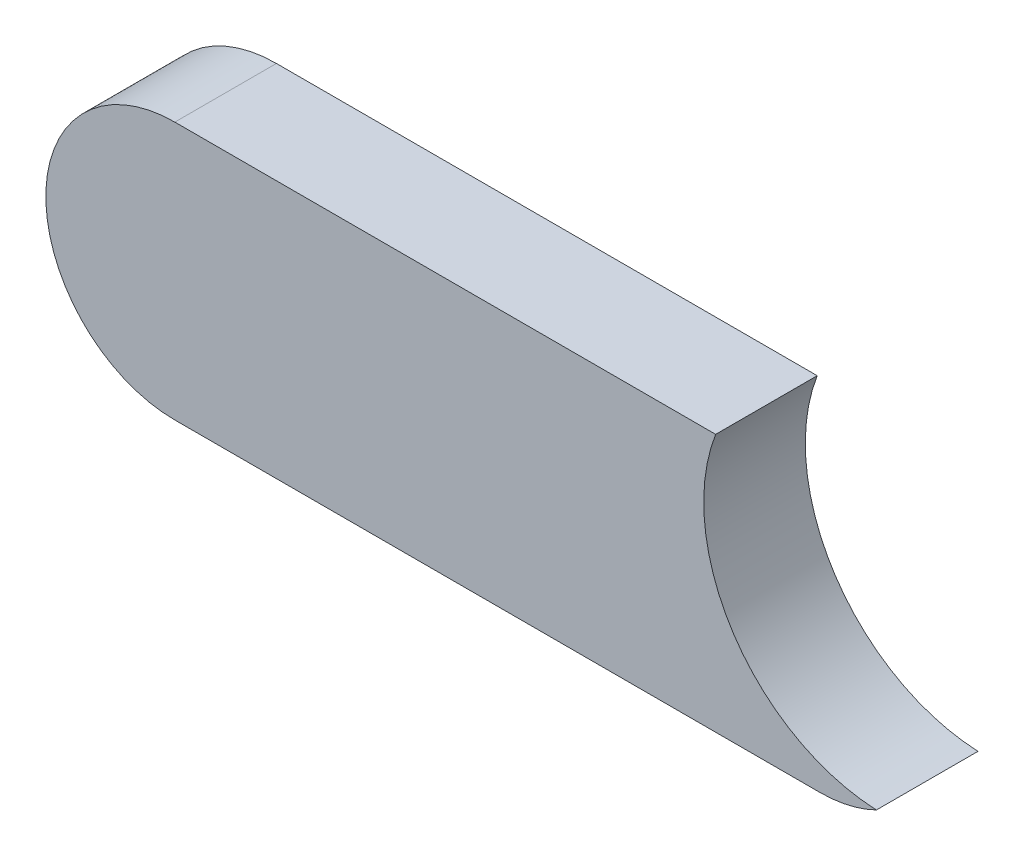
ISO-10303-21;
HEADER;
FILE_DESCRIPTION(('STEP AP214'),'2;1');
FILE_NAME('part.step','',(''),(''),'','','');
FILE_SCHEMA(('AUTOMOTIVE_DESIGN { 1 0 10303 214 1 1 1 1 }'));
ENDSEC;
DATA;
#1=APPLICATION_CONTEXT('core data for automotive mechanical design processes');
#2=APPLICATION_PROTOCOL_DEFINITION('international standard','automotive_design',2000,#1);
#3=PRODUCT_CONTEXT('',#1,'mechanical');
#4=PRODUCT('Part','Part','',(#3));
#5=PRODUCT_RELATED_PRODUCT_CATEGORY('part','',(#4));
#6=PRODUCT_DEFINITION_FORMATION('','',#4);
#7=PRODUCT_DEFINITION_CONTEXT('part definition',#1,'design');
#8=PRODUCT_DEFINITION('design','',#6,#7);
#9=PRODUCT_DEFINITION_SHAPE('','',#8);
#10=(LENGTH_UNIT() NAMED_UNIT(*) SI_UNIT(.MILLI.,.METRE.));
#11=(NAMED_UNIT(*) PLANE_ANGLE_UNIT() SI_UNIT($,.RADIAN.));
#12=(NAMED_UNIT(*) SI_UNIT($,.STERADIAN.) SOLID_ANGLE_UNIT());
#13=UNCERTAINTY_MEASURE_WITH_UNIT(LENGTH_MEASURE(1.E-05),#10,'distance_accuracy_value','');
#14=(GEOMETRIC_REPRESENTATION_CONTEXT(3) GLOBAL_UNCERTAINTY_ASSIGNED_CONTEXT((#13)) GLOBAL_UNIT_ASSIGNED_CONTEXT((#10,
#11,#12)) REPRESENTATION_CONTEXT('',''));
#15=CARTESIAN_POINT('',(0.,0.,0.));
#16=DIRECTION('',(0.,0.,1.));
#17=DIRECTION('',(1.,0.,0.));
#18=AXIS2_PLACEMENT_3D('',#15,#16,#17);
#19=CARTESIAN_POINT('',(135.001,111.252,0.));
#20=DIRECTION('',(0.,1.,0.));
#21=DIRECTION('',(1.,0.,0.));
#22=AXIS2_PLACEMENT_3D('',#19,#20,#21);
#23=PLANE('',#22);
#24=DIRECTION('',(1.,0.,0.));
#25=VECTOR('',#24,1.);
#26=CARTESIAN_POINT('',(135.001,111.252,0.1999996));
#27=LINE('',#26,#25);
#28=CARTESIAN_POINT('',(135.001,111.252,0.1999996));
#29=VERTEX_POINT('',#28);
#30=CARTESIAN_POINT('',(136.271,111.252,0.1999996));
#31=VERTEX_POINT('',#30);
#32=EDGE_CURVE('E11',#29,#31,#27,.T.);
#33=ORIENTED_EDGE('',*,*,#32,.F.);
#34=DIRECTION('',(0.,0.,1.));
#35=VECTOR('',#34,1.);
#36=CARTESIAN_POINT('',(135.001,111.252,0.));
#37=LINE('',#36,#35);
#38=CARTESIAN_POINT('',(135.001,111.252,0.));
#39=VERTEX_POINT('',#38);
#40=EDGE_CURVE('E24',#39,#29,#37,.T.);
#41=ORIENTED_EDGE('',*,*,#40,.F.);
#42=DIRECTION('',(1.,0.,0.));
#43=VECTOR('',#42,1.);
#44=CARTESIAN_POINT('',(135.001,111.252,0.));
#45=LINE('',#44,#43);
#46=CARTESIAN_POINT('',(136.271,111.252,0.));
#47=VERTEX_POINT('',#46);
#48=EDGE_CURVE('E82',#39,#47,#45,.T.);
#49=ORIENTED_EDGE('',*,*,#48,.T.);
#50=DIRECTION('',(0.,0.,1.));
#51=VECTOR('',#50,1.);
#52=CARTESIAN_POINT('',(136.271,111.252,0.));
#53=LINE('',#52,#51);
#54=EDGE_CURVE('E37',#47,#31,#53,.T.);
#55=ORIENTED_EDGE('',*,*,#54,.T.);
#56=EDGE_LOOP('',(#33,#41,#49,#55));
#57=FACE_BOUND('',#56,.T.);
#58=ADVANCED_FACE('F17',(#57),#23,.F.);
#59=CARTESIAN_POINT('',(136.271,111.506,0.));
#60=DIRECTION('',(0.,0.,-1.));
#61=DIRECTION('',(0.,-1.,0.));
#62=AXIS2_PLACEMENT_3D('',#59,#60,#61);
#63=CYLINDRICAL_SURFACE('',#62,0.25400000000001);
#64=CARTESIAN_POINT('',(136.271,111.506,0.1999996));
#65=DIRECTION('',(0.,0.,1.));
#66=DIRECTION('',(0.,-1.,0.));
#67=AXIS2_PLACEMENT_3D('',#64,#65,#66);
#68=CIRCLE('',#67,0.25400000000001);
#69=CARTESIAN_POINT('',(136.382418463253,111.277741536747,0.1999996));
#70=VERTEX_POINT('',#69);
#71=EDGE_CURVE('E98',#31,#70,#68,.T.);
#72=ORIENTED_EDGE('',*,*,#71,.F.);
#73=ORIENTED_EDGE('',*,*,#54,.F.);
#74=CARTESIAN_POINT('',(136.271,111.506,0.));
#75=DIRECTION('',(0.,0.,1.));
#76=DIRECTION('',(0.,-1.,0.));
#77=AXIS2_PLACEMENT_3D('',#74,#75,#76);
#78=CIRCLE('',#77,0.25400000000001);
#79=CARTESIAN_POINT('',(136.382418463253,111.277741536747,0.));
#80=VERTEX_POINT('',#79);
#81=EDGE_CURVE('E95',#47,#80,#78,.T.);
#82=ORIENTED_EDGE('',*,*,#81,.T.);
#83=DIRECTION('',(0.,0.,1.));
#84=VECTOR('',#83,1.);
#85=CARTESIAN_POINT('',(136.382418463253,111.277741536747,0.));
#86=LINE('',#85,#84);
#87=EDGE_CURVE('E93',#80,#70,#86,.T.);
#88=ORIENTED_EDGE('',*,*,#87,.T.);
#89=EDGE_LOOP('',(#72,#73,#82,#88));
#90=FACE_BOUND('',#89,.T.);
#91=ADVANCED_FACE('F104',(#90),#63,.T.);
#92=CARTESIAN_POINT('',(136.398,111.633,0.));
#93=DIRECTION('',(0.,0.,-1.));
#94=DIRECTION('',(1.,0.,0.));
#95=AXIS2_PLACEMENT_3D('',#92,#93,#94);
#96=CYLINDRICAL_SURFACE('',#95,0.3556);
#97=DIRECTION('',(0.,0.,1.));
#98=VECTOR('',#97,1.);
#99=CARTESIAN_POINT('',(136.065851900502,111.76,0.));
#100=LINE('',#99,#98);
#101=CARTESIAN_POINT('',(136.065851900502,111.76,0.));
#102=VERTEX_POINT('',#101);
#103=CARTESIAN_POINT('',(136.065851900502,111.76,0.1999996));
#104=VERTEX_POINT('',#103);
#105=EDGE_CURVE('E73',#102,#104,#100,.T.);
#106=ORIENTED_EDGE('',*,*,#105,.T.);
#107=CARTESIAN_POINT('',(136.398,111.633,0.1999996));
#108=DIRECTION('',(0.,0.,1.));
#109=DIRECTION('',(1.,0.,0.));
#110=AXIS2_PLACEMENT_3D('',#107,#108,#109);
#111=CIRCLE('',#110,0.3556);
#112=EDGE_CURVE('E89',#104,#70,#111,.T.);
#113=ORIENTED_EDGE('',*,*,#112,.T.);
#114=ORIENTED_EDGE('',*,*,#87,.F.);
#115=CARTESIAN_POINT('',(136.398,111.633,0.));
#116=DIRECTION('',(0.,0.,1.));
#117=DIRECTION('',(1.,0.,0.));
#118=AXIS2_PLACEMENT_3D('',#115,#116,#117);
#119=CIRCLE('',#118,0.3556);
#120=EDGE_CURVE('E87',#102,#80,#119,.T.);
#121=ORIENTED_EDGE('',*,*,#120,.F.);
#122=EDGE_LOOP('',(#106,#113,#114,#121));
#123=FACE_BOUND('',#122,.T.);
#124=ADVANCED_FACE('F109',(#123),#96,.F.);
#125=CARTESIAN_POINT('',(136.065851900502,111.76,0.));
#126=DIRECTION('',(0.,-1.,0.));
#127=DIRECTION('',(-1.,0.,0.));
#128=AXIS2_PLACEMENT_3D('',#125,#126,#127);
#129=PLANE('',#128);
#130=DIRECTION('',(-1.,0.,0.));
#131=VECTOR('',#130,1.);
#132=CARTESIAN_POINT('',(136.271,111.76,0.1999996));
#133=LINE('',#132,#131);
#134=CARTESIAN_POINT('',(135.001,111.76,0.1999996));
#135=VERTEX_POINT('',#134);
#136=EDGE_CURVE('E77',#104,#135,#133,.T.);
#137=ORIENTED_EDGE('',*,*,#136,.F.);
#138=ORIENTED_EDGE('',*,*,#105,.F.);
#139=DIRECTION('',(-1.,0.,0.));
#140=VECTOR('',#139,1.);
#141=CARTESIAN_POINT('',(136.271,111.76,0.));
#142=LINE('',#141,#140);
#143=CARTESIAN_POINT('',(135.001,111.76,0.));
#144=VERTEX_POINT('',#143);
#145=EDGE_CURVE('E69',#102,#144,#142,.T.);
#146=ORIENTED_EDGE('',*,*,#145,.T.);
#147=DIRECTION('',(0.,0.,1.));
#148=VECTOR('',#147,1.);
#149=CARTESIAN_POINT('',(135.001,111.76,0.));
#150=LINE('',#149,#148);
#151=EDGE_CURVE('E59',#144,#135,#150,.T.);
#152=ORIENTED_EDGE('',*,*,#151,.T.);
#153=EDGE_LOOP('',(#137,#138,#146,#152));
#154=FACE_BOUND('',#153,.T.);
#155=ADVANCED_FACE('F72',(#154),#129,.F.);
#156=CARTESIAN_POINT('',(135.001,111.506,0.));
#157=DIRECTION('',(0.,0.,-1.));
#158=DIRECTION('',(-1.11896493820486E-13,1.,0.));
#159=AXIS2_PLACEMENT_3D('',#156,#157,#158);
#160=CYLINDRICAL_SURFACE('',#159,0.25400000000001);
#161=CARTESIAN_POINT('',(135.001,111.506,0.1999996));
#162=DIRECTION('',(0.,0.,1.));
#163=DIRECTION('',(-1.11896493820486E-13,1.,0.));
#164=AXIS2_PLACEMENT_3D('',#161,#162,#163);
#165=CIRCLE('',#164,0.25400000000001);
#166=EDGE_CURVE('E65',#135,#29,#165,.T.);
#167=ORIENTED_EDGE('',*,*,#166,.F.);
#168=ORIENTED_EDGE('',*,*,#151,.F.);
#169=CARTESIAN_POINT('',(135.001,111.506,0.));
#170=DIRECTION('',(0.,0.,1.));
#171=DIRECTION('',(-1.11896493820486E-13,1.,0.));
#172=AXIS2_PLACEMENT_3D('',#169,#170,#171);
#173=CIRCLE('',#172,0.25400000000001);
#174=EDGE_CURVE('E63',#144,#39,#173,.T.);
#175=ORIENTED_EDGE('',*,*,#174,.T.);
#176=ORIENTED_EDGE('',*,*,#40,.T.);
#177=EDGE_LOOP('',(#167,#168,#175,#176));
#178=FACE_BOUND('',#177,.T.);
#179=ADVANCED_FACE('F61',(#178),#160,.T.);
#180=CARTESIAN_POINT('',(135.001,111.252,0.));
#181=DIRECTION('',(0.,0.,-1.));
#182=DIRECTION('',(-1.,0.,0.));
#183=AXIS2_PLACEMENT_3D('',#180,#181,#182);
#184=PLANE('',#183);
#185=ORIENTED_EDGE('',*,*,#48,.F.);
#186=ORIENTED_EDGE('',*,*,#174,.F.);
#187=ORIENTED_EDGE('',*,*,#145,.F.);
#188=ORIENTED_EDGE('',*,*,#120,.T.);
#189=ORIENTED_EDGE('',*,*,#81,.F.);
#190=EDGE_LOOP('',(#185,#186,#187,#188,#189));
#191=FACE_BOUND('',#190,.T.);
#192=ADVANCED_FACE('F80',(#191),#184,.T.);
#193=CARTESIAN_POINT('',(135.001,111.252,0.1999996));
#194=DIRECTION('',(0.,0.,-1.));
#195=DIRECTION('',(-1.,0.,0.));
#196=AXIS2_PLACEMENT_3D('',#193,#194,#195);
#197=PLANE('',#196);
#198=ORIENTED_EDGE('',*,*,#166,.T.);
#199=ORIENTED_EDGE('',*,*,#32,.T.);
#200=ORIENTED_EDGE('',*,*,#71,.T.);
#201=ORIENTED_EDGE('',*,*,#112,.F.);
#202=ORIENTED_EDGE('',*,*,#136,.T.);
#203=EDGE_LOOP('',(#198,#199,#200,#201,#202));
#204=FACE_BOUND('',#203,.T.);
#205=ADVANCED_FACE('F107',(#204),#197,.F.);
#206=CLOSED_SHELL('',(#58,#91,#124,#155,#179,#192,#205));
#207=MANIFOLD_SOLID_BREP('B1',#206);
#208=ADVANCED_BREP_SHAPE_REPRESENTATION('',(#18,#207),#14);
#209=SHAPE_DEFINITION_REPRESENTATION(#9,#208);
ENDSEC;
END-ISO-10303-21;
